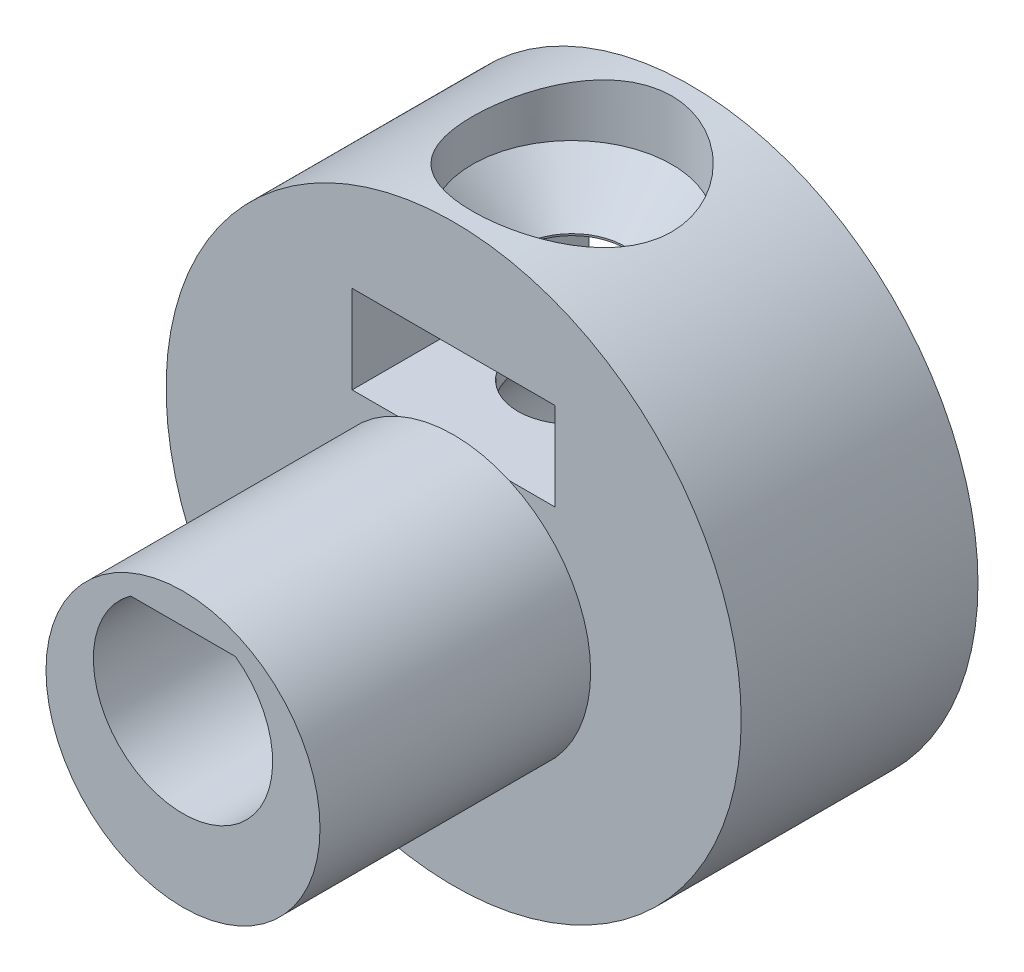
ISO-10303-21;
HEADER;
FILE_DESCRIPTION(('STEP AP214'),'2;1');
FILE_NAME('part.step','',(''),(''),'','','');
FILE_SCHEMA(('AUTOMOTIVE_DESIGN { 1 0 10303 214 1 1 1 1 }'));
ENDSEC;
DATA;
#1=APPLICATION_CONTEXT('core data for automotive mechanical design processes');
#2=APPLICATION_PROTOCOL_DEFINITION('international standard','automotive_design',2000,#1);
#3=PRODUCT_CONTEXT('',#1,'mechanical');
#4=PRODUCT('Part','Part','',(#3));
#5=PRODUCT_RELATED_PRODUCT_CATEGORY('part','',(#4));
#6=PRODUCT_DEFINITION_FORMATION('','',#4);
#7=PRODUCT_DEFINITION_CONTEXT('part definition',#1,'design');
#8=PRODUCT_DEFINITION('design','',#6,#7);
#9=PRODUCT_DEFINITION_SHAPE('','',#8);
#10=(LENGTH_UNIT() NAMED_UNIT(*) SI_UNIT(.MILLI.,.METRE.));
#11=(NAMED_UNIT(*) PLANE_ANGLE_UNIT() SI_UNIT($,.RADIAN.));
#12=(NAMED_UNIT(*) SI_UNIT($,.STERADIAN.) SOLID_ANGLE_UNIT());
#13=UNCERTAINTY_MEASURE_WITH_UNIT(LENGTH_MEASURE(1.E-05),#10,'distance_accuracy_value','');
#14=(GEOMETRIC_REPRESENTATION_CONTEXT(3) GLOBAL_UNCERTAINTY_ASSIGNED_CONTEXT((#13)) GLOBAL_UNIT_ASSIGNED_CONTEXT((#10,
#11,#12)) REPRESENTATION_CONTEXT('',''));
#15=CARTESIAN_POINT('',(0.,0.,0.));
#16=DIRECTION('',(0.,0.,1.));
#17=DIRECTION('',(1.,0.,0.));
#18=AXIS2_PLACEMENT_3D('',#15,#16,#17);
#19=CARTESIAN_POINT('',(0.,0.,7.));
#20=DIRECTION('',(0.,0.,-1.));
#21=DIRECTION('',(-1.,0.,0.));
#22=AXIS2_PLACEMENT_3D('',#19,#20,#21);
#23=CYLINDRICAL_SURFACE('',#22,8.5);
#24=CARTESIAN_POINT('',(0.,0.,7.));
#25=DIRECTION('',(0.,0.,1.));
#26=DIRECTION('',(1.,0.,0.));
#27=AXIS2_PLACEMENT_3D('',#24,#25,#26);
#28=CIRCLE('',#27,8.5);
#29=CARTESIAN_POINT('',(8.5,0.,7.));
#30=VERTEX_POINT('',#29);
#31=EDGE_CURVE('E274',#30,#30,#28,.T.);
#32=ORIENTED_EDGE('',*,*,#31,.F.);
#33=EDGE_LOOP('',(#32));
#34=FACE_BOUND('',#33,.T.);
#35=CARTESIAN_POINT('',(0.,0.,0.));
#36=DIRECTION('',(0.,0.,1.));
#37=DIRECTION('',(1.,0.,0.));
#38=AXIS2_PLACEMENT_3D('',#35,#36,#37);
#39=CIRCLE('',#38,8.5);
#40=CARTESIAN_POINT('',(8.5,0.,0.));
#41=VERTEX_POINT('',#40);
#42=EDGE_CURVE('E268',#41,#41,#39,.T.);
#43=ORIENTED_EDGE('',*,*,#42,.T.);
#44=EDGE_LOOP('',(#43));
#45=FACE_BOUND('',#44,.T.);
#46=CARTESIAN_POINT('',(-2.4976566133076,8.12475916209218,5.06978069869673));
#47=CARTESIAN_POINT('',(-2.45319115247167,8.13842624372445,5.14052214784692));
#48=CARTESIAN_POINT('',(-2.40579379129014,8.15259906685285,5.20926792787036));
#49=CARTESIAN_POINT('',(-2.30541918353998,8.18155142551015,5.34241791198123));
#50=CARTESIAN_POINT('',(-2.25244214730842,8.19633093815584,5.40682227957694));
#51=CARTESIAN_POINT('',(-2.08559993364935,8.24096387551114,5.59296340845329));
#52=CARTESIAN_POINT('',(-1.96379293821466,8.27112157248585,5.70767691704536));
#53=CARTESIAN_POINT('',(-1.70636003995567,8.32797463190604,5.91184711282402));
#54=CARTESIAN_POINT('',(-1.57128592838729,8.35474881482083,6.001981892767));
#55=CARTESIAN_POINT('',(-1.28750137103305,8.40315485018163,6.15915511575892));
#56=CARTESIAN_POINT('',(-1.13879895604352,8.42478970443847,6.22620705151039));
#57=CARTESIAN_POINT('',(-0.831187937836323,8.46068191069057,6.33519131239508));
#58=CARTESIAN_POINT('',(-0.672256571938539,8.47492212101672,6.37706530718806));
#59=CARTESIAN_POINT('',(-0.349104402202425,8.4943684291606,6.43385731899328));
#60=CARTESIAN_POINT('',(-0.184884583871302,8.49957620037078,6.44878032909372));
#61=CARTESIAN_POINT('',(0.138015723993134,8.50036011208845,6.45103621336103));
#62=CARTESIAN_POINT('',(0.296689734672785,8.4962657088658,6.43931282000832));
#63=CARTESIAN_POINT('',(0.609739891194811,8.47955195455849,6.39064304040091));
#64=CARTESIAN_POINT('',(0.764113634581695,8.46692793384153,6.35368283786199));
#65=CARTESIAN_POINT('',(1.06375533887611,8.4345186012922,6.25603150933245));
#66=CARTESIAN_POINT('',(1.20905000683216,8.41475557760322,6.19541419459285));
#67=CARTESIAN_POINT('',(1.48731375058839,8.37004774740902,6.0524065686952));
#68=CARTESIAN_POINT('',(1.62030956781964,8.34511458458429,5.97006507104002));
#69=CARTESIAN_POINT('',(1.77519124725063,8.31261821534849,5.85638504059988));
#70=CARTESIAN_POINT('',(1.8043222672237,8.30634083738567,5.83415379011479));
#71=CARTESIAN_POINT('',(1.96343933734412,8.27119610111673,5.70795471337644));
#72=CARTESIAN_POINT('',(2.08511950406867,8.24108270241644,5.59342954668651));
#73=CARTESIAN_POINT('',(2.30774596317545,8.1815459992705,5.34519120906915));
#74=CARTESIAN_POINT('',(2.40863639693148,8.15212473740542,5.2114279425932));
#75=CARTESIAN_POINT('',(2.58236776313032,8.09871823066431,4.93498995802956));
#76=CARTESIAN_POINT('',(2.65633004978303,8.07453878944836,4.79306002253415));
#77=CARTESIAN_POINT('',(2.7805092495441,8.03262664641585,4.49839769507062));
#78=CARTESIAN_POINT('',(2.83074936112862,8.01488765027596,4.34567602537025));
#79=CARTESIAN_POINT('',(2.90591996981457,7.98794413403531,4.03295557266693));
#80=CARTESIAN_POINT('',(2.9307875433104,7.97876083684202,3.87293972081594));
#81=CARTESIAN_POINT('',(2.95398174635075,7.97020434608399,3.55072336269741));
#82=CARTESIAN_POINT('',(2.95230970967962,7.97083065952385,3.38852296662646));
#83=CARTESIAN_POINT('',(2.92298994582522,7.98162544091318,3.07214390352963));
#84=CARTESIAN_POINT('',(2.89618320404268,7.9914849607523,2.91787537801917));
#85=CARTESIAN_POINT('',(2.81878881465332,8.01910824594589,2.61614548479724));
#86=CARTESIAN_POINT('',(2.76819372913322,8.03687448340477,2.46868626200185));
#87=CARTESIAN_POINT('',(2.64374182838853,8.07867559451911,2.18164089371048));
#88=CARTESIAN_POINT('',(2.56947203344734,8.10282034535183,2.04225083932772));
#89=CARTESIAN_POINT('',(2.4000811737298,8.15459461002143,1.77756977114323));
#90=CARTESIAN_POINT('',(2.30497218991925,8.18222210090779,1.65227065192168));
#91=CARTESIAN_POINT('',(2.14444672038787,8.22525010429297,1.47244158886466));
#92=CARTESIAN_POINT('',(2.08555070125962,8.24041673348502,1.41191270278541));
#93=CARTESIAN_POINT('',(1.96287977928872,8.27049513310864,1.29621000389169));
#94=CARTESIAN_POINT('',(1.89911464567286,8.28540734404793,1.24102594733433));
#95=CARTESIAN_POINT('',(1.83303027798234,8.3,1.18861513373476));
#96=B_SPLINE_CURVE_WITH_KNOTS('',3,(#46,#47,#48,#49,#50,#51,#52,#53,#54,#55,#56,#57,#58,#59,#60,
#61,#62,#63,#64,#65,#66,#67,#68,#69,#70,#71,#72,#73,#74,#75,#76,#77,#78,#79,#80,#81,#82,#83,#84,
#85,#86,#87,#88,#89,#90,#91,#92,#93,#94,#95),.UNSPECIFIED.,.F.,.F.,(4,2,2,2,2,2,2,2,2,2,2,2,2,2,
2,2,2,2,2,2,2,2,2,2,4),(0.,0.253833285787019,0.507657006239854,1.01513132403204,
1.50672343842426,1.99802771074243,2.49046585733758,2.98281276276087,3.4579950628208,
3.93343771763219,4.40740867898813,4.88032358222269,4.99186106409764,5.49853142231878,
6.00654586378571,6.48996962093975,6.9729196424049,7.45706448441352,7.94118499513888,
8.40966421544493,8.87829001289202,9.35558437726861,9.83260277159268,10.0897481621581,
10.3463905361852),.UNSPECIFIED.);
#97=CARTESIAN_POINT('',(-1.83303027798234,8.3,5.81138486626524));
#98=VERTEX_POINT('',#97);
#99=CARTESIAN_POINT('',(1.83303027798234,8.3,1.18861513373476));
#100=VERTEX_POINT('',#99);
#101=EDGE_CURVE('E189',#98,#100,#96,.T.);
#102=ORIENTED_EDGE('',*,*,#101,.F.);
#103=CARTESIAN_POINT('',(2.4976566133076,8.12475916209218,1.93021930130327));
#104=CARTESIAN_POINT('',(2.45318994500136,8.13842662563914,1.85947588226206));
#105=CARTESIAN_POINT('',(2.40579116119691,8.15259985847907,1.79072823574639));
#106=CARTESIAN_POINT('',(2.30541346555239,8.18155304169366,1.6575748509336));
#107=CARTESIAN_POINT('',(2.25243477065462,8.19633296846693,1.5931689439928));
#108=CARTESIAN_POINT('',(2.08559334134924,8.24096552582563,1.40703032681757));
#109=CARTESIAN_POINT('',(1.96378968996023,8.27112236826603,1.2923202912556));
#110=CARTESIAN_POINT('',(1.70636391719496,8.32797369967156,1.08815617097751));
#111=CARTESIAN_POINT('',(1.57129368992825,8.35474701933418,0.998023916349741));
#112=CARTESIAN_POINT('',(1.28751241618149,8.40315343701242,0.840849493137524));
#113=CARTESIAN_POINT('',(1.1388084928932,8.42478919827129,0.773795353021942));
#114=CARTESIAN_POINT('',(0.827987048637116,8.4610547714335,0.663675633520592));
#115=CARTESIAN_POINT('',(0.665639156561353,8.47551136360076,0.621199419975944));
#116=CARTESIAN_POINT('',(0.335522235240602,8.49498290962041,0.56436373105513));
#117=CARTESIAN_POINT('',(0.167753698153421,8.4999987181954,0.550001710352122));
#118=CARTESIAN_POINT('',(-0.160573090672336,8.50000122693764,0.549998362858586));
#119=CARTESIAN_POINT('',(-0.321132585567959,8.49540802765908,0.563153976514742));
#120=CARTESIAN_POINT('',(-0.637504919535551,8.47754145494676,0.615247090544994));
#121=CARTESIAN_POINT('',(-0.793317230736235,8.46426711985929,0.654187447232615));
#122=CARTESIAN_POINT('',(-1.10584501784713,8.42931993487434,0.759821744334155));
#123=CARTESIAN_POINT('',(-1.26194403527556,8.40715150324722,0.828174744399635));
#124=CARTESIAN_POINT('',(-1.55944141682563,8.35708973169379,0.990147520116793));
#125=CARTESIAN_POINT('',(-1.70083313076283,8.32919381878685,1.08377865754721));
#126=CARTESIAN_POINT('',(-1.96376574109255,8.27112897290653,1.29229244866549));
#127=CARTESIAN_POINT('',(-2.08550883931445,8.24098858276189,1.40692868073665));
#128=CARTESIAN_POINT('',(-2.30800118973862,8.1814676773007,1.65516964079898));
#129=CARTESIAN_POINT('',(-2.40875542862292,8.15208698294651,1.78876985048177));
#130=CARTESIAN_POINT('',(-2.58234889509949,8.09872513889258,2.06497202468677));
#131=CARTESIAN_POINT('',(-2.65628388776906,8.07455420965996,2.20684835983295));
#132=CARTESIAN_POINT('',(-2.78047378166719,8.03263878107992,2.50150025801988));
#133=CARTESIAN_POINT('',(-2.83073638027927,8.01489219321013,2.65427225956399));
#134=CARTESIAN_POINT('',(-2.90592304531664,7.98794314173254,2.96705492968833));
#135=CARTESIAN_POINT('',(-2.9307908841645,7.97875964189572,3.12708084544346));
#136=CARTESIAN_POINT('',(-2.95398136626459,7.9702044484857,3.44929719503748));
#137=CARTESIAN_POINT('',(-2.95230871741702,7.97083101474781,3.61148723989113));
#138=CARTESIAN_POINT('',(-2.92299011430598,7.98162538865863,3.92785476293909));
#139=CARTESIAN_POINT('',(-2.89618368313548,7.99148478657943,4.08212194506856));
#140=CARTESIAN_POINT('',(-2.81878968112678,8.01910794001413,4.38385194667557));
#141=CARTESIAN_POINT('',(-2.76819426046636,8.03687430454259,4.53131250247069));
#142=CARTESIAN_POINT('',(-2.6437418358828,8.07867559240639,4.81835909920957));
#143=CARTESIAN_POINT('',(-2.56947204541021,8.10282034150987,4.95774914059871));
#144=CARTESIAN_POINT('',(-2.40008118744198,8.1545946059138,5.22243020880838));
#145=CARTESIAN_POINT('',(-2.30497219775281,8.18222209879261,5.34772933892776));
#146=CARTESIAN_POINT('',(-2.14444664458044,8.22525012462106,5.52755849626095));
#147=CARTESIAN_POINT('',(-2.08555054227539,8.24041677442083,5.58808746070075));
#148=CARTESIAN_POINT('',(-1.96287960668323,8.27049517345836,5.70379014541685));
#149=CARTESIAN_POINT('',(-1.89911455609382,8.28540736381247,5.75897412356356));
#150=CARTESIAN_POINT('',(-1.83303027798234,8.3,5.81138486626524));
#151=B_SPLINE_CURVE_WITH_KNOTS('',3,(#103,#104,#105,#106,#107,#108,#109,#110,#111,#112,#113,
#114,#115,#116,#117,#118,#119,#120,#121,#122,#123,#124,#125,#126,#127,#128,#129,#130,#131,#132,
#133,#134,#135,#136,#137,#138,#139,#140,#141,#142,#143,#144,#145,#146,#147,#148,#149,#150),
.UNSPECIFIED.,.F.,.F.,(4,2,2,2,2,2,2,2,2,2,2,2,2,2,2,2,2,2,2,2,2,2,2,4),(0.,0.253840367119801,
0.50767086877788,1.01513136017837,1.50670724536165,1.99802774497997,2.50068775902432,
3.00330226248912,3.48440262049298,3.96555628146755,4.47840114630792,4.99147690469338,
5.49887966106123,6.00616172724637,6.48942722983445,6.97253548375081,7.45671110324845,
7.94080083792565,8.40927599969572,8.87790585615661,9.35520018446692,9.83221861486184,
10.0893643522644,10.3460063794543),.UNSPECIFIED.);
#152=EDGE_CURVE('E196',#100,#98,#151,.T.);
#153=ORIENTED_EDGE('',*,*,#152,.F.);
#154=EDGE_LOOP('',(#102,#153));
#155=FACE_BOUND('',#154,.T.);
#156=ADVANCED_FACE('F39',(#34,#45,#155),#23,.T.);
#157=CARTESIAN_POINT('',(0.,2.7,3.5));
#158=DIRECTION('',(0.,-1.,0.));
#159=DIRECTION('',(0.,0.,1.));
#160=AXIS2_PLACEMENT_3D('',#157,#158,#159);
#161=CONICAL_SURFACE('',#160,1.6,0.0174532925199433);
#162=CARTESIAN_POINT('',(0.,5.35146683778932,3.5));
#163=DIRECTION('',(0.,1.,0.));
#164=DIRECTION('',(0.,0.,1.));
#165=AXIS2_PLACEMENT_3D('',#162,#163,#164);
#166=CIRCLE('',#165,1.55371847419137);
#167=CARTESIAN_POINT('',(0.,5.35146683778932,5.05371847419137));
#168=VERTEX_POINT('',#167);
#169=EDGE_CURVE('E201',#168,#168,#166,.T.);
#170=ORIENTED_EDGE('',*,*,#169,.T.);
#171=EDGE_LOOP('',(#170));
#172=FACE_BOUND('',#171,.T.);
#173=CARTESIAN_POINT('',(0.,5.3,3.5));
#174=DIRECTION('',(0.,1.,0.));
#175=DIRECTION('',(0.,0.,1.));
#176=AXIS2_PLACEMENT_3D('',#173,#174,#175);
#177=CIRCLE('',#176,1.55461683118663);
#178=CARTESIAN_POINT('',(0.,5.3,5.05461683118663));
#179=VERTEX_POINT('',#178);
#180=EDGE_CURVE('E257',#179,#179,#177,.T.);
#181=ORIENTED_EDGE('',*,*,#180,.F.);
#182=EDGE_LOOP('',(#181));
#183=FACE_BOUND('',#182,.T.);
#184=ADVANCED_FACE('F186',(#172,#183),#161,.F.);
#185=CARTESIAN_POINT('',(0.,0.,7.));
#186=DIRECTION('',(0.,0.,1.));
#187=DIRECTION('',(1.,0.,0.));
#188=AXIS2_PLACEMENT_3D('',#185,#186,#187);
#189=PLANE('',#188);
#190=CARTESIAN_POINT('',(0.,-1.,7.));
#191=DIRECTION('',(0.,0.,1.));
#192=DIRECTION('',(1.,0.,0.));
#193=AXIS2_PLACEMENT_3D('',#190,#191,#192);
#194=CIRCLE('',#193,4.05);
#195=CARTESIAN_POINT('',(-1.64696690920006,2.7,7.));
#196=VERTEX_POINT('',#195);
#197=CARTESIAN_POINT('',(1.64696690920006,2.7,7.));
#198=VERTEX_POINT('',#197);
#199=EDGE_CURVE('E11',#196,#198,#194,.T.);
#200=ORIENTED_EDGE('',*,*,#199,.F.);
#201=DIRECTION('',(-1.,0.,0.));
#202=VECTOR('',#201,1.);
#203=CARTESIAN_POINT('',(3.,2.7,7.));
#204=LINE('',#203,#202);
#205=CARTESIAN_POINT('',(-3.,2.7,7.));
#206=VERTEX_POINT('',#205);
#207=EDGE_CURVE('E412',#196,#206,#204,.T.);
#208=ORIENTED_EDGE('',*,*,#207,.T.);
#209=DIRECTION('',(0.,1.,0.));
#210=VECTOR('',#209,1.);
#211=CARTESIAN_POINT('',(-3.,2.7,7.));
#212=LINE('',#211,#210);
#213=CARTESIAN_POINT('',(-3.,5.3,7.));
#214=VERTEX_POINT('',#213);
#215=EDGE_CURVE('E248',#206,#214,#212,.T.);
#216=ORIENTED_EDGE('',*,*,#215,.T.);
#217=DIRECTION('',(1.,0.,0.));
#218=VECTOR('',#217,1.);
#219=CARTESIAN_POINT('',(3.,5.3,7.));
#220=LINE('',#219,#218);
#221=CARTESIAN_POINT('',(3.,5.3,7.));
#222=VERTEX_POINT('',#221);
#223=EDGE_CURVE('E408',#214,#222,#220,.T.);
#224=ORIENTED_EDGE('',*,*,#223,.T.);
#225=DIRECTION('',(0.,-1.,0.));
#226=VECTOR('',#225,1.);
#227=CARTESIAN_POINT('',(3.,2.7,7.));
#228=LINE('',#227,#226);
#229=CARTESIAN_POINT('',(3.,2.7,7.));
#230=VERTEX_POINT('',#229);
#231=EDGE_CURVE('E410',#222,#230,#228,.T.);
#232=ORIENTED_EDGE('',*,*,#231,.T.);
#233=EDGE_CURVE('E263',#230,#198,#204,.T.);
#234=ORIENTED_EDGE('',*,*,#233,.T.);
#235=EDGE_LOOP('',(#200,#208,#216,#224,#232,#234));
#236=FACE_BOUND('',#235,.T.);
#237=ORIENTED_EDGE('',*,*,#31,.T.);
#238=EDGE_LOOP('',(#237));
#239=FACE_BOUND('',#238,.T.);
#240=ADVANCED_FACE('F211',(#236,#239),#189,.T.);
#241=CARTESIAN_POINT('',(0.,0.,0.));
#242=DIRECTION('',(0.,0.,1.));
#243=DIRECTION('',(1.,0.,0.));
#244=AXIS2_PLACEMENT_3D('',#241,#242,#243);
#245=PLANE('',#244);
#246=DIRECTION('',(1.,0.,0.));
#247=VECTOR('',#246,1.);
#248=CARTESIAN_POINT('',(1.54919333848297,2.15,0.));
#249=LINE('',#248,#247);
#250=CARTESIAN_POINT('',(-1.54919333848297,2.15,0.));
#251=VERTEX_POINT('',#250);
#252=CARTESIAN_POINT('',(1.54919333848297,2.15,0.));
#253=VERTEX_POINT('',#252);
#254=EDGE_CURVE('E139',#251,#253,#249,.T.);
#255=ORIENTED_EDGE('',*,*,#254,.F.);
#256=CARTESIAN_POINT('',(0.,0.,0.));
#257=DIRECTION('',(0.,0.,-1.));
#258=DIRECTION('',(-1.,0.,0.));
#259=AXIS2_PLACEMENT_3D('',#256,#257,#258);
#260=CIRCLE('',#259,2.65);
#261=EDGE_CURVE('E57',#253,#251,#260,.T.);
#262=ORIENTED_EDGE('',*,*,#261,.F.);
#263=EDGE_LOOP('',(#255,#262));
#264=FACE_BOUND('',#263,.T.);
#265=DIRECTION('',(1.,0.,0.));
#266=VECTOR('',#265,1.);
#267=CARTESIAN_POINT('',(3.,5.3,0.));
#268=LINE('',#267,#266);
#269=CARTESIAN_POINT('',(-3.,5.3,0.));
#270=VERTEX_POINT('',#269);
#271=CARTESIAN_POINT('',(3.,5.3,0.));
#272=VERTEX_POINT('',#271);
#273=EDGE_CURVE('E255',#270,#272,#268,.T.);
#274=ORIENTED_EDGE('',*,*,#273,.F.);
#275=DIRECTION('',(0.,1.,0.));
#276=VECTOR('',#275,1.);
#277=CARTESIAN_POINT('',(-3.,2.7,0.));
#278=LINE('',#277,#276);
#279=CARTESIAN_POINT('',(-3.,2.7,0.));
#280=VERTEX_POINT('',#279);
#281=EDGE_CURVE('E252',#280,#270,#278,.T.);
#282=ORIENTED_EDGE('',*,*,#281,.F.);
#283=DIRECTION('',(-1.,0.,0.));
#284=VECTOR('',#283,1.);
#285=CARTESIAN_POINT('',(3.,2.7,0.));
#286=LINE('',#285,#284);
#287=CARTESIAN_POINT('',(3.,2.7,0.));
#288=VERTEX_POINT('',#287);
#289=EDGE_CURVE('E238',#288,#280,#286,.T.);
#290=ORIENTED_EDGE('',*,*,#289,.F.);
#291=DIRECTION('',(0.,-1.,0.));
#292=VECTOR('',#291,1.);
#293=CARTESIAN_POINT('',(3.,2.7,0.));
#294=LINE('',#293,#292);
#295=EDGE_CURVE('E249',#272,#288,#294,.T.);
#296=ORIENTED_EDGE('',*,*,#295,.F.);
#297=EDGE_LOOP('',(#274,#282,#290,#296));
#298=FACE_BOUND('',#297,.T.);
#299=ORIENTED_EDGE('',*,*,#42,.F.);
#300=EDGE_LOOP('',(#299));
#301=FACE_BOUND('',#300,.T.);
#302=ADVANCED_FACE('F206',(#264,#298,#301),#245,.F.);
#303=CARTESIAN_POINT('',(-3.,2.7,7.));
#304=DIRECTION('',(-1.,0.,0.));
#305=DIRECTION('',(0.,0.,1.));
#306=AXIS2_PLACEMENT_3D('',#303,#304,#305);
#307=PLANE('',#306);
#308=ORIENTED_EDGE('',*,*,#281,.T.);
#309=DIRECTION('',(0.,0.,-1.));
#310=VECTOR('',#309,1.);
#311=CARTESIAN_POINT('',(-3.,5.3,7.));
#312=LINE('',#311,#310);
#313=EDGE_CURVE('E272',#214,#270,#312,.T.);
#314=ORIENTED_EDGE('',*,*,#313,.F.);
#315=ORIENTED_EDGE('',*,*,#215,.F.);
#316=DIRECTION('',(0.,0.,-1.));
#317=VECTOR('',#316,1.);
#318=CARTESIAN_POINT('',(-3.,2.7,7.));
#319=LINE('',#318,#317);
#320=EDGE_CURVE('E241',#206,#280,#319,.T.);
#321=ORIENTED_EDGE('',*,*,#320,.T.);
#322=EDGE_LOOP('',(#308,#314,#315,#321));
#323=FACE_BOUND('',#322,.T.);
#324=ADVANCED_FACE('F210',(#323),#307,.F.);
#325=CARTESIAN_POINT('',(3.,2.7,7.));
#326=DIRECTION('',(0.,-1.,0.));
#327=DIRECTION('',(0.,0.,-1.));
#328=AXIS2_PLACEMENT_3D('',#325,#326,#327);
#329=PLANE('',#328);
#330=CARTESIAN_POINT('',(0.,2.7,3.5));
#331=DIRECTION('',(0.,1.,0.));
#332=DIRECTION('',(0.,0.,1.));
#333=AXIS2_PLACEMENT_3D('',#330,#331,#332);
#334=CIRCLE('',#333,1.6);
#335=CARTESIAN_POINT('',(0.,2.7,5.1));
#336=VERTEX_POINT('',#335);
#337=EDGE_CURVE('E234',#336,#336,#334,.T.);
#338=ORIENTED_EDGE('',*,*,#337,.F.);
#339=EDGE_LOOP('',(#338));
#340=FACE_BOUND('',#339,.T.);
#341=ORIENTED_EDGE('',*,*,#289,.T.);
#342=ORIENTED_EDGE('',*,*,#320,.F.);
#343=ORIENTED_EDGE('',*,*,#207,.F.);
#344=EDGE_CURVE('E413',#198,#196,#204,.T.);
#345=ORIENTED_EDGE('',*,*,#344,.F.);
#346=ORIENTED_EDGE('',*,*,#233,.F.);
#347=DIRECTION('',(0.,0.,-1.));
#348=VECTOR('',#347,1.);
#349=CARTESIAN_POINT('',(3.,2.7,7.));
#350=LINE('',#349,#348);
#351=EDGE_CURVE('E244',#230,#288,#350,.T.);
#352=ORIENTED_EDGE('',*,*,#351,.T.);
#353=EDGE_LOOP('',(#341,#342,#343,#345,#346,#352));
#354=FACE_BOUND('',#353,.T.);
#355=ADVANCED_FACE('F218',(#340,#354),#329,.F.);
#356=CARTESIAN_POINT('',(3.,2.7,7.));
#357=DIRECTION('',(1.,0.,0.));
#358=DIRECTION('',(0.,0.,-1.));
#359=AXIS2_PLACEMENT_3D('',#356,#357,#358);
#360=PLANE('',#359);
#361=ORIENTED_EDGE('',*,*,#295,.T.);
#362=ORIENTED_EDGE('',*,*,#351,.F.);
#363=ORIENTED_EDGE('',*,*,#231,.F.);
#364=DIRECTION('',(0.,0.,-1.));
#365=VECTOR('',#364,1.);
#366=CARTESIAN_POINT('',(3.,5.3,7.));
#367=LINE('',#366,#365);
#368=EDGE_CURVE('E270',#222,#272,#367,.T.);
#369=ORIENTED_EDGE('',*,*,#368,.T.);
#370=EDGE_LOOP('',(#361,#362,#363,#369));
#371=FACE_BOUND('',#370,.T.);
#372=ADVANCED_FACE('F223',(#371),#360,.F.);
#373=CARTESIAN_POINT('',(3.,5.3,7.));
#374=DIRECTION('',(0.,1.,0.));
#375=DIRECTION('',(0.,0.,1.));
#376=AXIS2_PLACEMENT_3D('',#373,#374,#375);
#377=PLANE('',#376);
#378=ORIENTED_EDGE('',*,*,#180,.T.);
#379=EDGE_LOOP('',(#378));
#380=FACE_BOUND('',#379,.T.);
#381=ORIENTED_EDGE('',*,*,#273,.T.);
#382=ORIENTED_EDGE('',*,*,#368,.F.);
#383=ORIENTED_EDGE('',*,*,#223,.F.);
#384=ORIENTED_EDGE('',*,*,#313,.T.);
#385=EDGE_LOOP('',(#381,#382,#383,#384));
#386=FACE_BOUND('',#385,.T.);
#387=ADVANCED_FACE('F220',(#380,#386),#377,.F.);
#388=CARTESIAN_POINT('',(0.,2.7,3.5));
#389=DIRECTION('',(0.,1.,0.));
#390=DIRECTION('',(0.,0.,1.));
#391=AXIS2_PLACEMENT_3D('',#388,#389,#390);
#392=CONICAL_SURFACE('',#391,1.6,0.0174532925199433);
#393=CARTESIAN_POINT('',(-1.00549557480747,2.45183169264177,4.73900592127049));
#394=CARTESIAN_POINT('',(-1.04114906063982,2.43721135745625,4.70973492411046));
#395=CARTESIAN_POINT('',(-1.07542625410772,2.42224402908244,4.67901298512249));
#396=CARTESIAN_POINT('',(-1.14113413618689,2.3919911165622,4.61478896234473));
#397=CARTESIAN_POINT('',(-1.17256416605369,2.37670545976558,4.58128623858694));
#398=CARTESIAN_POINT('',(-1.26270371489511,2.33080024736449,4.47647961952857));
#399=CARTESIAN_POINT('',(-1.3169213793621,2.30027878291521,4.40115812157085));
#400=CARTESIAN_POINT('',(-1.40629379304243,2.24660375824557,4.25085287167676));
#401=CARTESIAN_POINT('',(-1.44295733493256,2.22300554787248,4.17691904176447));
#402=CARTESIAN_POINT('',(-1.50480606414261,2.18161599156685,4.02299630739797));
#403=CARTESIAN_POINT('',(-1.53002196404735,2.16380914501963,3.94302428393103));
#404=CARTESIAN_POINT('',(-1.56538722996714,2.13833561803012,3.78928784099944));
#405=CARTESIAN_POINT('',(-1.57705374091451,2.12966159914898,3.7160420403303));
#406=CARTESIAN_POINT('',(-1.59014005884272,2.11991289887216,3.56815841155053));
#407=CARTESIAN_POINT('',(-1.59157084202674,2.11883007714015,3.49352216064572));
#408=CARTESIAN_POINT('',(-1.58548333059455,2.12337948339012,3.37193606875479));
#409=CARTESIAN_POINT('',(-1.58100764763395,2.12672985034913,3.32471299614241));
#410=CARTESIAN_POINT('',(-1.56798037685201,2.13635288799468,3.23114685616058));
#411=CARTESIAN_POINT('',(-1.55942919035661,2.14262527094097,3.18480370261023));
#412=CARTESIAN_POINT('',(-1.52879158791388,2.16469903940939,3.05164292920928));
#413=CARTESIAN_POINT('',(-1.50147787835819,2.18396975180046,2.96655242033379));
#414=CARTESIAN_POINT('',(-1.43395728016035,2.228877436446,2.80330921314797));
#415=CARTESIAN_POINT('',(-1.39370771912562,2.25453541476779,2.72518058550496));
#416=CARTESIAN_POINT('',(-1.30194872073587,2.30873494744538,2.57771103157382));
#417=CARTESIAN_POINT('',(-1.25050699034981,2.33725863013626,2.50832106290542));
#418=CARTESIAN_POINT('',(-1.13729649217,2.39437899722569,2.37889254633403));
#419=CARTESIAN_POINT('',(-1.07555521978666,2.42297529276594,2.31882990155459));
#420=CARTESIAN_POINT('',(-0.973645329723348,2.46495538640708,2.23468821152848));
#421=CARTESIAN_POINT('',(-0.936852338139143,2.47921167114098,2.20689545209238));
#422=CARTESIAN_POINT('',(-0.898791632785118,2.49292470821633,2.18067432943348));
#423=B_SPLINE_CURVE_WITH_KNOTS('',3,(#393,#394,#395,#396,#397,#398,#399,#400,#401,#402,#403,
#404,#405,#406,#407,#408,#409,#410,#411,#412,#413,#414,#415,#416,#417,#418,#419,#420,#421,#422),
.UNSPECIFIED.,.F.,.F.,(4,2,2,2,2,2,2,2,2,2,2,2,2,2,4),(0.,0.145071479904694,0.290176439531789,
0.581766707980872,0.838270578911275,1.09408215532818,1.31709735954096,1.53987337923491,
1.68227071544396,1.82465403229528,2.09719464809532,2.37064370291009,2.6424823768656,
2.91360664134894,3.05822890437435),.UNSPECIFIED.);
#424=CARTESIAN_POINT('',(-1.54919333848297,2.15,3.85968215303523));
#425=VERTEX_POINT('',#424);
#426=CARTESIAN_POINT('',(-1.54919333848297,2.15,3.14031784696477));
#427=VERTEX_POINT('',#426);
#428=EDGE_CURVE('E126',#425,#427,#423,.T.);
#429=ORIENTED_EDGE('',*,*,#428,.T.);
#430=CARTESIAN_POINT('',(0.,2.15,3.5));
#431=DIRECTION('',(0.,1.,0.));
#432=DIRECTION('',(0.,0.,1.));
#433=AXIS2_PLACEMENT_3D('',#430,#431,#432);
#434=CIRCLE('',#433,1.59039971428948);
#435=CARTESIAN_POINT('',(1.54919333848297,2.15,3.14031784696477));
#436=VERTEX_POINT('',#435);
#437=EDGE_CURVE('E148',#427,#436,#434,.F.);
#438=ORIENTED_EDGE('',*,*,#437,.T.);
#439=CARTESIAN_POINT('',(0.898791632785026,2.49292470821636,2.18067432943361));
#440=CARTESIAN_POINT('',(0.936667174091869,2.47927051213931,2.20677179469448));
#441=CARTESIAN_POINT('',(0.973259453225839,2.46510033526094,2.23439898301896));
#442=CARTESIAN_POINT('',(1.04376767374676,2.43608335542143,2.29255564674331));
#443=CARTESIAN_POINT('',(1.0776838577636,2.42123661399444,2.32308485847476));
#444=CARTESIAN_POINT('',(1.17557016100806,2.37606906609189,2.41909811560865));
#445=CARTESIAN_POINT('',(1.23531890598578,2.34525629207016,2.4887590093276));
#446=CARTESIAN_POINT('',(1.33688746965532,2.28872592187343,2.63016587750862));
#447=CARTESIAN_POINT('',(1.37991409141054,2.26280912711403,2.70097533368797));
#448=CARTESIAN_POINT('',(1.45482090488903,2.21539112527075,2.84934873596978));
#449=CARTESIAN_POINT('',(1.48675047057393,2.19387053930524,2.92688079366915));
#450=CARTESIAN_POINT('',(1.52649078444639,2.16624330525176,3.05036293822033));
#451=CARTESIAN_POINT('',(1.53863568873332,2.15760350544296,3.09440326356597));
#452=CARTESIAN_POINT('',(1.56535931442556,2.13835763176975,3.21061831708121));
#453=CARTESIAN_POINT('',(1.57703147188091,2.12967844576872,3.28382997857632));
#454=CARTESIAN_POINT('',(1.59014126030158,2.11991175720869,3.43173189427637));
#455=CARTESIAN_POINT('',(1.59157347829999,2.11882826984196,3.5064229095725));
#456=CARTESIAN_POINT('',(1.58548214395148,2.12338026611942,3.6280890862294));
#457=CARTESIAN_POINT('',(1.58100449371541,2.12673176428264,3.6753374605698));
#458=CARTESIAN_POINT('',(1.56796810410584,2.13636236712984,3.7689134900266));
#459=CARTESIAN_POINT('',(1.55941459571286,2.1426377190938,3.8152422462226));
#460=CARTESIAN_POINT('',(1.54094020654753,2.1559447387288,3.89556858875685));
#461=CARTESIAN_POINT('',(1.53184205614671,2.16243213657927,3.92985371489501));
#462=CARTESIAN_POINT('',(1.50043301899892,2.18446260403059,4.03423185275902));
#463=CARTESIAN_POINT('',(1.47449693940168,2.20219390749595,4.10281478191649));
#464=CARTESIAN_POINT('',(1.41400483611516,2.24151597205148,4.23509657756863));
#465=CARTESIAN_POINT('',(1.37941774580058,2.26312056153268,4.29877673587795));
#466=CARTESIAN_POINT('',(1.29526821667221,2.3124797150711,4.43164032556896));
#467=CARTESIAN_POINT('',(1.24412065574424,2.34063391387645,4.49967528139335));
#468=CARTESIAN_POINT('',(1.13196937923128,2.39689663997294,4.62643012728681));
#469=CARTESIAN_POINT('',(1.07101505130892,2.42500471808072,4.68519391445854));
#470=CARTESIAN_POINT('',(1.00549557480747,2.45183169264177,4.73900592127049));
#471=B_SPLINE_CURVE_WITH_KNOTS('',3,(#439,#440,#441,#442,#443,#444,#445,#446,#447,#448,#449,
#450,#451,#452,#453,#454,#455,#456,#457,#458,#459,#460,#461,#462,#463,#464,#465,#466,#467,#468,
#469,#470),.UNSPECIFIED.,.F.,.F.,(4,2,2,2,2,2,2,2,2,2,2,2,2,2,2,4),(0.,0.143833004570379,
0.287652953408443,0.576648544720374,0.836182761295904,1.09454699171719,1.23385804067958,
1.45669474324779,1.67964923152965,1.82213074054759,1.96442987844758,2.07252839770362,
2.29791473700063,2.52412238271167,2.7920167906323,3.05860202213607),.UNSPECIFIED.);
#472=CARTESIAN_POINT('',(1.54919333848297,2.15,3.85968215303523));
#473=VERTEX_POINT('',#472);
#474=EDGE_CURVE('E156',#436,#473,#471,.T.);
#475=ORIENTED_EDGE('',*,*,#474,.T.);
#476=EDGE_CURVE('E145',#473,#425,#434,.F.);
#477=ORIENTED_EDGE('',*,*,#476,.T.);
#478=EDGE_LOOP('',(#429,#438,#475,#477));
#479=FACE_BOUND('',#478,.T.);
#480=ORIENTED_EDGE('',*,*,#337,.T.);
#481=EDGE_LOOP('',(#480));
#482=FACE_BOUND('',#481,.T.);
#483=ADVANCED_FACE('F162',(#479,#482),#392,.F.);
#484=CARTESIAN_POINT('',(0.,8.5,3.5));
#485=DIRECTION('',(0.,-1.,0.));
#486=DIRECTION('',(0.,0.,-1.));
#487=AXIS2_PLACEMENT_3D('',#484,#485,#486);
#488=CYLINDRICAL_SURFACE('',#487,2.95);
#489=ORIENTED_EDGE('',*,*,#101,.T.);
#490=ORIENTED_EDGE('',*,*,#152,.T.);
#491=EDGE_LOOP('',(#489,#490));
#492=FACE_BOUND('',#491,.T.);
#493=CARTESIAN_POINT('',(0.,6.74774836359798,3.5));
#494=DIRECTION('',(0.,1.,0.));
#495=DIRECTION('',(0.,0.,1.));
#496=AXIS2_PLACEMENT_3D('',#493,#494,#495);
#497=CIRCLE('',#496,2.95);
#498=CARTESIAN_POINT('',(0.,6.74774836359798,6.45));
#499=VERTEX_POINT('',#498);
#500=EDGE_CURVE('E44',#499,#499,#497,.F.);
#501=ORIENTED_EDGE('',*,*,#500,.T.);
#502=EDGE_LOOP('',(#501));
#503=FACE_BOUND('',#502,.T.);
#504=ADVANCED_FACE('F182',(#492,#503),#488,.F.);
#505=CARTESIAN_POINT('',(0.,5.35146683778934,3.5));
#506=DIRECTION('',(0.,1.,0.));
#507=DIRECTION('',(0.,0.,1.));
#508=AXIS2_PLACEMENT_3D('',#505,#506,#507);
#509=CONICAL_SURFACE('',#508,1.55371847419137,0.785398163397443);
#510=ORIENTED_EDGE('',*,*,#500,.F.);
#511=EDGE_LOOP('',(#510));
#512=FACE_BOUND('',#511,.T.);
#513=ORIENTED_EDGE('',*,*,#169,.F.);
#514=EDGE_LOOP('',(#513));
#515=FACE_BOUND('',#514,.T.);
#516=ADVANCED_FACE('F42',(#512,#515),#509,.F.);
#517=CARTESIAN_POINT('',(0.,-1.,7.));
#518=DIRECTION('',(0.,0.,1.));
#519=DIRECTION('',(1.,0.,0.));
#520=AXIS2_PLACEMENT_3D('',#517,#518,#519);
#521=PLANE('',#520);
#522=EDGE_CURVE('E50',#198,#196,#194,.T.);
#523=ORIENTED_EDGE('',*,*,#522,.F.);
#524=ORIENTED_EDGE('',*,*,#344,.T.);
#525=EDGE_LOOP('',(#523,#524));
#526=FACE_BOUND('',#525,.T.);
#527=ADVANCED_FACE('F175',(#526),#521,.F.);
#528=CARTESIAN_POINT('',(0.,-1.,15.));
#529=DIRECTION('',(0.,0.,-1.));
#530=DIRECTION('',(-1.,0.,0.));
#531=AXIS2_PLACEMENT_3D('',#528,#529,#530);
#532=CYLINDRICAL_SURFACE('',#531,4.05);
#533=CARTESIAN_POINT('',(0.,-1.,15.));
#534=DIRECTION('',(0.,0.,1.));
#535=DIRECTION('',(1.,0.,0.));
#536=AXIS2_PLACEMENT_3D('',#533,#534,#535);
#537=CIRCLE('',#536,4.05);
#538=CARTESIAN_POINT('',(4.05,-1.,15.));
#539=VERTEX_POINT('',#538);
#540=EDGE_CURVE('E402',#539,#539,#537,.T.);
#541=ORIENTED_EDGE('',*,*,#540,.F.);
#542=EDGE_LOOP('',(#541));
#543=FACE_BOUND('',#542,.T.);
#544=ORIENTED_EDGE('',*,*,#522,.T.);
#545=ORIENTED_EDGE('',*,*,#199,.T.);
#546=EDGE_LOOP('',(#544,#545));
#547=FACE_BOUND('',#546,.T.);
#548=ADVANCED_FACE('F174',(#543,#547),#532,.T.);
#549=CARTESIAN_POINT('',(0.,-1.,15.));
#550=DIRECTION('',(0.,0.,1.));
#551=DIRECTION('',(1.,0.,0.));
#552=AXIS2_PLACEMENT_3D('',#549,#550,#551);
#553=PLANE('',#552);
#554=CARTESIAN_POINT('',(0.,0.,15.));
#555=DIRECTION('',(0.,0.,-1.));
#556=DIRECTION('',(-1.,0.,0.));
#557=AXIS2_PLACEMENT_3D('',#554,#555,#556);
#558=CIRCLE('',#557,2.65);
#559=CARTESIAN_POINT('',(1.54919333848297,2.15,15.));
#560=VERTEX_POINT('',#559);
#561=CARTESIAN_POINT('',(-1.54919333848297,2.15,15.));
#562=VERTEX_POINT('',#561);
#563=EDGE_CURVE('E123',#560,#562,#558,.T.);
#564=ORIENTED_EDGE('',*,*,#563,.T.);
#565=DIRECTION('',(1.,0.,0.));
#566=VECTOR('',#565,1.);
#567=CARTESIAN_POINT('',(1.54919333848297,2.15,15.));
#568=LINE('',#567,#566);
#569=EDGE_CURVE('E132',#562,#560,#568,.T.);
#570=ORIENTED_EDGE('',*,*,#569,.T.);
#571=EDGE_LOOP('',(#564,#570));
#572=FACE_BOUND('',#571,.T.);
#573=ORIENTED_EDGE('',*,*,#540,.T.);
#574=EDGE_LOOP('',(#573));
#575=FACE_BOUND('',#574,.T.);
#576=ADVANCED_FACE('F137',(#572,#575),#553,.T.);
#577=CARTESIAN_POINT('',(0.,0.,15.));
#578=DIRECTION('',(0.,0.,-1.));
#579=DIRECTION('',(-1.,0.,0.));
#580=AXIS2_PLACEMENT_3D('',#577,#578,#579);
#581=CYLINDRICAL_SURFACE('',#580,2.65);
#582=DIRECTION('',(0.,0.,-1.));
#583=VECTOR('',#582,1.);
#584=CARTESIAN_POINT('',(1.54919333848297,2.15,15.));
#585=LINE('',#584,#583);
#586=EDGE_CURVE('E128',#436,#253,#585,.T.);
#587=ORIENTED_EDGE('',*,*,#586,.T.);
#588=ORIENTED_EDGE('',*,*,#261,.T.);
#589=DIRECTION('',(0.,0.,-1.));
#590=VECTOR('',#589,1.);
#591=CARTESIAN_POINT('',(-1.54919333848297,2.15,15.));
#592=LINE('',#591,#590);
#593=EDGE_CURVE('E129',#427,#251,#592,.T.);
#594=ORIENTED_EDGE('',*,*,#593,.F.);
#595=ORIENTED_EDGE('',*,*,#428,.F.);
#596=EDGE_CURVE('E65',#562,#425,#592,.T.);
#597=ORIENTED_EDGE('',*,*,#596,.F.);
#598=ORIENTED_EDGE('',*,*,#563,.F.);
#599=EDGE_CURVE('E134',#560,#473,#585,.T.);
#600=ORIENTED_EDGE('',*,*,#599,.T.);
#601=ORIENTED_EDGE('',*,*,#474,.F.);
#602=EDGE_LOOP('',(#587,#588,#594,#595,#597,#598,#600,#601));
#603=FACE_BOUND('',#602,.T.);
#604=ADVANCED_FACE('F120',(#603),#581,.F.);
#605=CARTESIAN_POINT('',(1.54919333848297,2.15,15.));
#606=DIRECTION('',(0.,1.,0.));
#607=DIRECTION('',(0.,0.,1.));
#608=AXIS2_PLACEMENT_3D('',#605,#606,#607);
#609=PLANE('',#608);
#610=ORIENTED_EDGE('',*,*,#593,.T.);
#611=ORIENTED_EDGE('',*,*,#254,.T.);
#612=ORIENTED_EDGE('',*,*,#586,.F.);
#613=ORIENTED_EDGE('',*,*,#437,.F.);
#614=EDGE_LOOP('',(#610,#611,#612,#613));
#615=FACE_BOUND('',#614,.T.);
#616=ADVANCED_FACE('F170',(#615),#609,.F.);
#617=ORIENTED_EDGE('',*,*,#599,.F.);
#618=ORIENTED_EDGE('',*,*,#569,.F.);
#619=ORIENTED_EDGE('',*,*,#596,.T.);
#620=ORIENTED_EDGE('',*,*,#476,.F.);
#621=EDGE_LOOP('',(#617,#618,#619,#620));
#622=FACE_BOUND('',#621,.T.);
#623=ADVANCED_FACE('F133',(#622),#609,.F.);
#624=CLOSED_SHELL('',(#156,#184,#240,#302,#324,#355,#372,#387,#483,#504,#516,#527,#548,#576,
#604,#616,#623));
#625=MANIFOLD_SOLID_BREP('B2',#624);
#626=ADVANCED_BREP_SHAPE_REPRESENTATION('',(#18,#625),#14);
#627=SHAPE_DEFINITION_REPRESENTATION(#9,#626);
ENDSEC;
END-ISO-10303-21;
